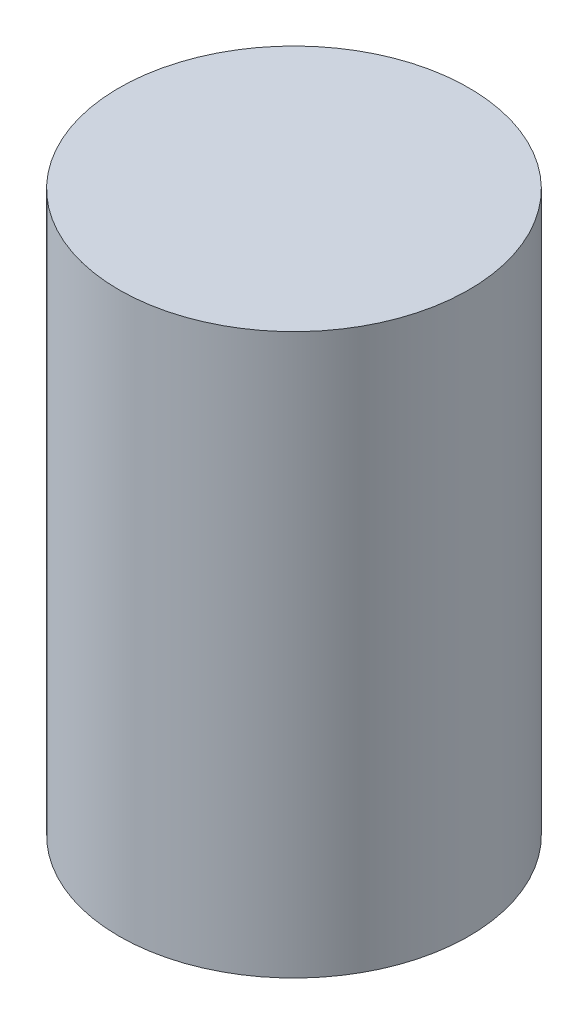
ISO-10303-21;
HEADER;
FILE_DESCRIPTION(('STEP AP214'),'2;1');
FILE_NAME('part.step','',(''),(''),'','','');
FILE_SCHEMA(('AUTOMOTIVE_DESIGN { 1 0 10303 214 1 1 1 1 }'));
ENDSEC;
DATA;
#1=APPLICATION_CONTEXT('core data for automotive mechanical design processes');
#2=APPLICATION_PROTOCOL_DEFINITION('international standard','automotive_design',2000,#1);
#3=PRODUCT_CONTEXT('',#1,'mechanical');
#4=PRODUCT('Part','Part','',(#3));
#5=PRODUCT_RELATED_PRODUCT_CATEGORY('part','',(#4));
#6=PRODUCT_DEFINITION_FORMATION('','',#4);
#7=PRODUCT_DEFINITION_CONTEXT('part definition',#1,'design');
#8=PRODUCT_DEFINITION('design','',#6,#7);
#9=PRODUCT_DEFINITION_SHAPE('','',#8);
#10=(LENGTH_UNIT() NAMED_UNIT(*) SI_UNIT(.MILLI.,.METRE.));
#11=(NAMED_UNIT(*) PLANE_ANGLE_UNIT() SI_UNIT($,.RADIAN.));
#12=(NAMED_UNIT(*) SI_UNIT($,.STERADIAN.) SOLID_ANGLE_UNIT());
#13=UNCERTAINTY_MEASURE_WITH_UNIT(LENGTH_MEASURE(1.E-05),#10,'distance_accuracy_value','');
#14=(GEOMETRIC_REPRESENTATION_CONTEXT(3) GLOBAL_UNCERTAINTY_ASSIGNED_CONTEXT((#13)) GLOBAL_UNIT_ASSIGNED_CONTEXT((#10,
#11,#12)) REPRESENTATION_CONTEXT('',''));
#15=CARTESIAN_POINT('',(0.,0.,0.));
#16=DIRECTION('',(0.,0.,1.));
#17=DIRECTION('',(1.,0.,0.));
#18=AXIS2_PLACEMENT_3D('',#15,#16,#17);
#19=CARTESIAN_POINT('',(0.,800.,0.));
#20=DIRECTION('',(0.,-1.,0.));
#21=DIRECTION('',(0.,0.,-1.));
#22=AXIS2_PLACEMENT_3D('',#19,#20,#21);
#23=CYLINDRICAL_SURFACE('',#22,250.);
#24=CARTESIAN_POINT('',(0.,800.,0.));
#25=DIRECTION('',(0.,1.,0.));
#26=DIRECTION('',(0.,0.,1.));
#27=AXIS2_PLACEMENT_3D('',#24,#25,#26);
#28=CIRCLE('',#27,250.);
#29=CARTESIAN_POINT('',(0.,800.,250.));
#30=VERTEX_POINT('',#29);
#31=EDGE_CURVE('E10',#30,#30,#28,.T.);
#32=ORIENTED_EDGE('',*,*,#31,.F.);
#33=EDGE_LOOP('',(#32));
#34=FACE_BOUND('',#33,.T.);
#35=CARTESIAN_POINT('',(0.,0.,0.));
#36=DIRECTION('',(0.,1.,0.));
#37=DIRECTION('',(0.,0.,1.));
#38=AXIS2_PLACEMENT_3D('',#35,#36,#37);
#39=CIRCLE('',#38,250.);
#40=CARTESIAN_POINT('',(0.,0.,250.));
#41=VERTEX_POINT('',#40);
#42=EDGE_CURVE('E38',#41,#41,#39,.T.);
#43=ORIENTED_EDGE('',*,*,#42,.T.);
#44=EDGE_LOOP('',(#43));
#45=FACE_BOUND('',#44,.T.);
#46=ADVANCED_FACE('F35',(#34,#45),#23,.T.);
#47=CARTESIAN_POINT('',(0.,800.,0.));
#48=DIRECTION('',(0.,1.,0.));
#49=DIRECTION('',(0.,0.,1.));
#50=AXIS2_PLACEMENT_3D('',#47,#48,#49);
#51=PLANE('',#50);
#52=ORIENTED_EDGE('',*,*,#31,.T.);
#53=EDGE_LOOP('',(#52));
#54=FACE_BOUND('',#53,.T.);
#55=ADVANCED_FACE('F50',(#54),#51,.T.);
#56=CARTESIAN_POINT('',(0.,0.,0.));
#57=DIRECTION('',(0.,1.,0.));
#58=DIRECTION('',(0.,0.,1.));
#59=AXIS2_PLACEMENT_3D('',#56,#57,#58);
#60=PLANE('',#59);
#61=ORIENTED_EDGE('',*,*,#42,.F.);
#62=EDGE_LOOP('',(#61));
#63=FACE_BOUND('',#62,.T.);
#64=ADVANCED_FACE('F48',(#63),#60,.F.);
#65=CLOSED_SHELL('',(#46,#55,#64));
#66=MANIFOLD_SOLID_BREP('B2',#65);
#67=ADVANCED_BREP_SHAPE_REPRESENTATION('',(#18,#66),#14);
#68=SHAPE_DEFINITION_REPRESENTATION(#9,#67);
ENDSEC;
END-ISO-10303-21;
